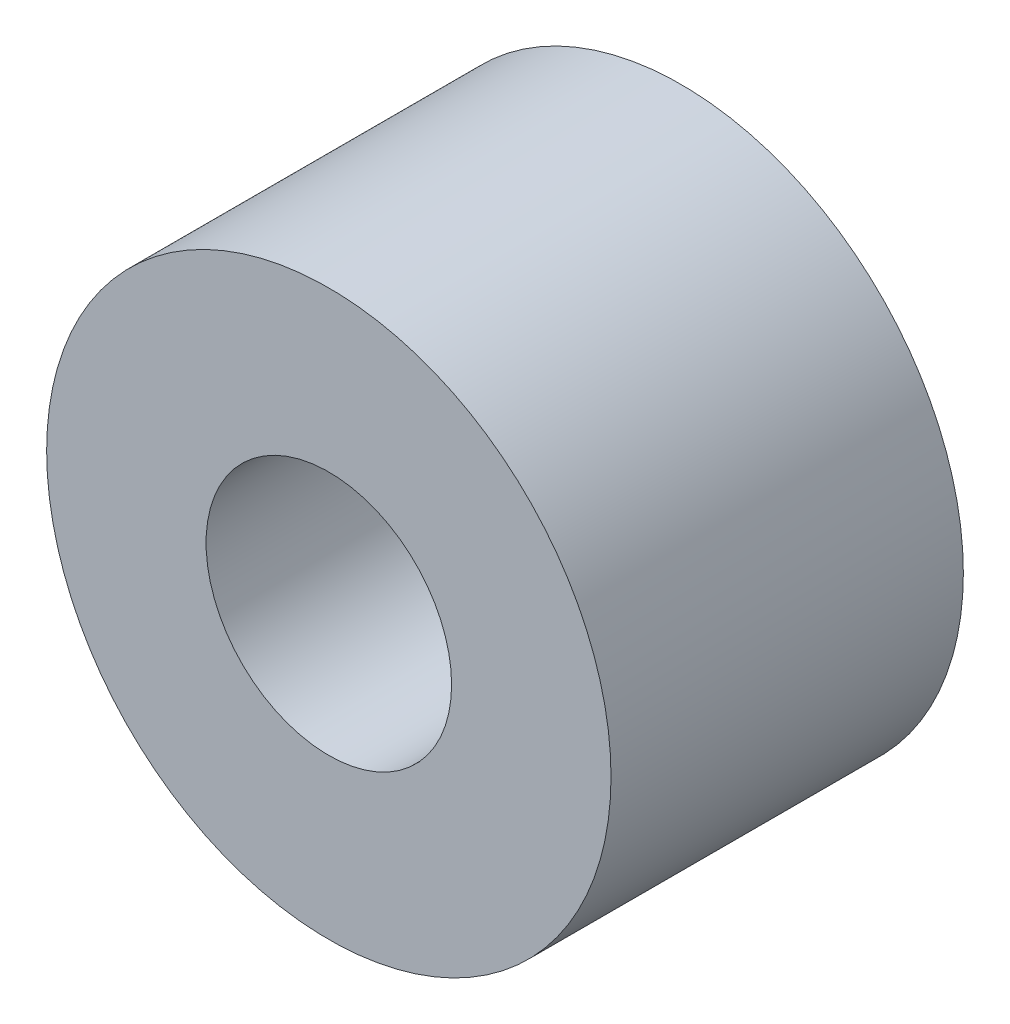
ISO-10303-21;
HEADER;
FILE_DESCRIPTION(('STEP AP214'),'2;1');
FILE_NAME('part.step','',(''),(''),'','','');
FILE_SCHEMA(('AUTOMOTIVE_DESIGN { 1 0 10303 214 1 1 1 1 }'));
ENDSEC;
DATA;
#1=APPLICATION_CONTEXT('core data for automotive mechanical design processes');
#2=APPLICATION_PROTOCOL_DEFINITION('international standard','automotive_design',2000,#1);
#3=PRODUCT_CONTEXT('',#1,'mechanical');
#4=PRODUCT('Part','Part','',(#3));
#5=PRODUCT_RELATED_PRODUCT_CATEGORY('part','',(#4));
#6=PRODUCT_DEFINITION_FORMATION('','',#4);
#7=PRODUCT_DEFINITION_CONTEXT('part definition',#1,'design');
#8=PRODUCT_DEFINITION('design','',#6,#7);
#9=PRODUCT_DEFINITION_SHAPE('','',#8);
#10=(LENGTH_UNIT() NAMED_UNIT(*) SI_UNIT(.MILLI.,.METRE.));
#11=(NAMED_UNIT(*) PLANE_ANGLE_UNIT() SI_UNIT($,.RADIAN.));
#12=(NAMED_UNIT(*) SI_UNIT($,.STERADIAN.) SOLID_ANGLE_UNIT());
#13=UNCERTAINTY_MEASURE_WITH_UNIT(LENGTH_MEASURE(1.E-05),#10,'distance_accuracy_value','');
#14=(GEOMETRIC_REPRESENTATION_CONTEXT(3) GLOBAL_UNCERTAINTY_ASSIGNED_CONTEXT((#13)) GLOBAL_UNIT_ASSIGNED_CONTEXT((#10,
#11,#12)) REPRESENTATION_CONTEXT('',''));
#15=CARTESIAN_POINT('',(0.,0.,0.));
#16=DIRECTION('',(0.,0.,1.));
#17=DIRECTION('',(1.,0.,0.));
#18=AXIS2_PLACEMENT_3D('',#15,#16,#17);
#19=CARTESIAN_POINT('',(0.,0.,14.0335));
#20=DIRECTION('',(0.,0.,1.));
#21=DIRECTION('',(1.,0.,0.));
#22=AXIS2_PLACEMENT_3D('',#19,#20,#21);
#23=PLANE('',#22);
#24=CARTESIAN_POINT('',(0.,0.,14.0335));
#25=DIRECTION('',(0.,0.,1.));
#26=DIRECTION('',(1.,0.,0.));
#27=AXIS2_PLACEMENT_3D('',#24,#25,#26);
#28=CIRCLE('',#27,11.2395);
#29=CARTESIAN_POINT('',(11.2395,0.,14.0335));
#30=VERTEX_POINT('',#29);
#31=EDGE_CURVE('E10',#30,#30,#28,.T.);
#32=ORIENTED_EDGE('',*,*,#31,.T.);
#33=EDGE_LOOP('',(#32));
#34=FACE_BOUND('',#33,.T.);
#35=CARTESIAN_POINT('',(0.,0.,14.0335));
#36=DIRECTION('',(0.,0.,1.));
#37=DIRECTION('',(1.,0.,0.));
#38=AXIS2_PLACEMENT_3D('',#35,#36,#37);
#39=CIRCLE('',#38,4.8895);
#40=CARTESIAN_POINT('',(4.8895,0.,14.0335));
#41=VERTEX_POINT('',#40);
#42=EDGE_CURVE('E44',#41,#41,#39,.T.);
#43=ORIENTED_EDGE('',*,*,#42,.F.);
#44=EDGE_LOOP('',(#43));
#45=FACE_BOUND('',#44,.T.);
#46=ADVANCED_FACE('F33',(#34,#45),#23,.T.);
#47=CARTESIAN_POINT('',(0.,0.,0.));
#48=DIRECTION('',(0.,0.,1.));
#49=DIRECTION('',(1.,0.,0.));
#50=AXIS2_PLACEMENT_3D('',#47,#48,#49);
#51=PLANE('',#50);
#52=CARTESIAN_POINT('',(0.,0.,0.));
#53=DIRECTION('',(0.,0.,1.));
#54=DIRECTION('',(1.,0.,0.));
#55=AXIS2_PLACEMENT_3D('',#52,#53,#54);
#56=CIRCLE('',#55,11.2395);
#57=CARTESIAN_POINT('',(11.2395,0.,0.));
#58=VERTEX_POINT('',#57);
#59=EDGE_CURVE('E37',#58,#58,#56,.T.);
#60=ORIENTED_EDGE('',*,*,#59,.F.);
#61=EDGE_LOOP('',(#60));
#62=FACE_BOUND('',#61,.T.);
#63=CARTESIAN_POINT('',(0.,0.,0.));
#64=DIRECTION('',(0.,0.,1.));
#65=DIRECTION('',(1.,0.,0.));
#66=AXIS2_PLACEMENT_3D('',#63,#64,#65);
#67=CIRCLE('',#66,4.8895);
#68=CARTESIAN_POINT('',(4.8895,0.,0.));
#69=VERTEX_POINT('',#68);
#70=EDGE_CURVE('E46',#69,#69,#67,.T.);
#71=ORIENTED_EDGE('',*,*,#70,.T.);
#72=EDGE_LOOP('',(#71));
#73=FACE_BOUND('',#72,.T.);
#74=ADVANCED_FACE('F56',(#62,#73),#51,.F.);
#75=CARTESIAN_POINT('',(0.,0.,14.0335));
#76=DIRECTION('',(0.,0.,-1.));
#77=DIRECTION('',(-1.,0.,0.));
#78=AXIS2_PLACEMENT_3D('',#75,#76,#77);
#79=CYLINDRICAL_SURFACE('',#78,11.2395);
#80=ORIENTED_EDGE('',*,*,#31,.F.);
#81=EDGE_LOOP('',(#80));
#82=FACE_BOUND('',#81,.T.);
#83=ORIENTED_EDGE('',*,*,#59,.T.);
#84=EDGE_LOOP('',(#83));
#85=FACE_BOUND('',#84,.T.);
#86=ADVANCED_FACE('F35',(#82,#85),#79,.T.);
#87=CARTESIAN_POINT('',(0.,0.,14.0335));
#88=DIRECTION('',(0.,0.,-1.));
#89=DIRECTION('',(-1.,0.,0.));
#90=AXIS2_PLACEMENT_3D('',#87,#88,#89);
#91=CYLINDRICAL_SURFACE('',#90,4.8895);
#92=ORIENTED_EDGE('',*,*,#42,.T.);
#93=EDGE_LOOP('',(#92));
#94=FACE_BOUND('',#93,.T.);
#95=ORIENTED_EDGE('',*,*,#70,.F.);
#96=EDGE_LOOP('',(#95));
#97=FACE_BOUND('',#96,.T.);
#98=ADVANCED_FACE('F52',(#94,#97),#91,.F.);
#99=CLOSED_SHELL('',(#46,#74,#86,#98));
#100=MANIFOLD_SOLID_BREP('B2',#99);
#101=ADVANCED_BREP_SHAPE_REPRESENTATION('',(#18,#100),#14);
#102=SHAPE_DEFINITION_REPRESENTATION(#9,#101);
ENDSEC;
END-ISO-10303-21;
